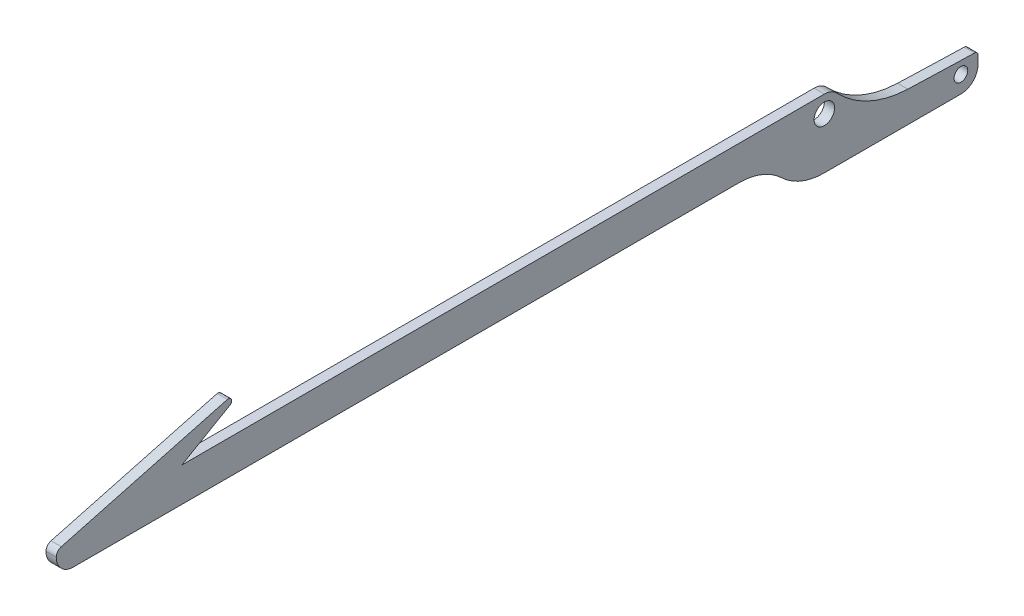
ISO-10303-21;
HEADER;
FILE_DESCRIPTION(('STEP AP214'),'2;1');
FILE_NAME('part.step','',(''),(''),'','','');
FILE_SCHEMA(('AUTOMOTIVE_DESIGN { 1 0 10303 214 1 1 1 1 }'));
ENDSEC;
DATA;
#1=APPLICATION_CONTEXT('core data for automotive mechanical design processes');
#2=APPLICATION_PROTOCOL_DEFINITION('international standard','automotive_design',2000,#1);
#3=PRODUCT_CONTEXT('',#1,'mechanical');
#4=PRODUCT('Part','Part','',(#3));
#5=PRODUCT_RELATED_PRODUCT_CATEGORY('part','',(#4));
#6=PRODUCT_DEFINITION_FORMATION('','',#4);
#7=PRODUCT_DEFINITION_CONTEXT('part definition',#1,'design');
#8=PRODUCT_DEFINITION('design','',#6,#7);
#9=PRODUCT_DEFINITION_SHAPE('','',#8);
#10=(LENGTH_UNIT() NAMED_UNIT(*) SI_UNIT(.MILLI.,.METRE.));
#11=(NAMED_UNIT(*) PLANE_ANGLE_UNIT() SI_UNIT($,.RADIAN.));
#12=(NAMED_UNIT(*) SI_UNIT($,.STERADIAN.) SOLID_ANGLE_UNIT());
#13=UNCERTAINTY_MEASURE_WITH_UNIT(LENGTH_MEASURE(1.E-05),#10,'distance_accuracy_value','');
#14=(GEOMETRIC_REPRESENTATION_CONTEXT(3) GLOBAL_UNCERTAINTY_ASSIGNED_CONTEXT((#13)) GLOBAL_UNIT_ASSIGNED_CONTEXT((#10,
#11,#12)) REPRESENTATION_CONTEXT('',''));
#15=CARTESIAN_POINT('',(0.,0.,0.));
#16=DIRECTION('',(0.,0.,1.));
#17=DIRECTION('',(1.,0.,0.));
#18=AXIS2_PLACEMENT_3D('',#15,#16,#17);
#19=CARTESIAN_POINT('',(-72.2106781186548,-15.,25.));
#20=DIRECTION('',(0.,-1.,0.));
#21=DIRECTION('',(0.,0.,-1.));
#22=AXIS2_PLACEMENT_3D('',#19,#20,#21);
#23=PLANE('',#22);
#24=DIRECTION('',(0.,0.,-1.));
#25=VECTOR('',#24,1.);
#26=CARTESIAN_POINT('',(1.5,-15.,25.));
#27=LINE('',#26,#25);
#28=CARTESIAN_POINT('',(1.5,-15.,0.));
#29=VERTEX_POINT('',#28);
#30=CARTESIAN_POINT('',(1.5,-15.,-40.));
#31=VERTEX_POINT('',#30);
#32=EDGE_CURVE('E376',#29,#31,#27,.T.);
#33=ORIENTED_EDGE('',*,*,#32,.F.);
#34=DIRECTION('',(1.,0.,0.));
#35=VECTOR('',#34,1.);
#36=CARTESIAN_POINT('',(-1.5,-15.,0.));
#37=LINE('',#36,#35);
#38=CARTESIAN_POINT('',(-1.5,-15.,0.));
#39=VERTEX_POINT('',#38);
#40=EDGE_CURVE('E388',#39,#29,#37,.T.);
#41=ORIENTED_EDGE('',*,*,#40,.F.);
#42=DIRECTION('',(0.,0.,1.));
#43=VECTOR('',#42,1.);
#44=CARTESIAN_POINT('',(-1.5,-15.,25.));
#45=LINE('',#44,#43);
#46=CARTESIAN_POINT('',(-1.5,-15.,-40.));
#47=VERTEX_POINT('',#46);
#48=EDGE_CURVE('E357',#47,#39,#45,.T.);
#49=ORIENTED_EDGE('',*,*,#48,.F.);
#50=DIRECTION('',(1.,0.,0.));
#51=VECTOR('',#50,1.);
#52=CARTESIAN_POINT('',(-72.2106781186548,-15.,-40.));
#53=LINE('',#52,#51);
#54=EDGE_CURVE('E215',#47,#31,#53,.T.);
#55=ORIENTED_EDGE('',*,*,#54,.T.);
#56=EDGE_LOOP('',(#33,#41,#49,#55));
#57=FACE_BOUND('',#56,.T.);
#58=ADVANCED_FACE('F48',(#57),#23,.T.);
#59=CARTESIAN_POINT('',(1.5,0.,0.));
#60=DIRECTION('',(1.,0.,0.));
#61=DIRECTION('',(0.,0.,-1.));
#62=AXIS2_PLACEMENT_3D('',#59,#60,#61);
#63=PLANE('',#62);
#64=CARTESIAN_POINT('',(1.5,-10.,-40.));
#65=DIRECTION('',(1.,0.,0.));
#66=DIRECTION('',(0.,0.,-1.));
#67=AXIS2_PLACEMENT_3D('',#64,#65,#66);
#68=CIRCLE('',#67,2.);
#69=CARTESIAN_POINT('',(1.5,-10.,-42.));
#70=VERTEX_POINT('',#69);
#71=EDGE_CURVE('E408',#70,#70,#68,.T.);
#72=ORIENTED_EDGE('',*,*,#71,.F.);
#73=EDGE_LOOP('',(#72));
#74=FACE_BOUND('',#73,.T.);
#75=CARTESIAN_POINT('',(1.5,0.,0.));
#76=DIRECTION('',(1.,0.,0.));
#77=DIRECTION('',(0.,0.,-1.));
#78=AXIS2_PLACEMENT_3D('',#75,#76,#77);
#79=CIRCLE('',#78,3.);
#80=CARTESIAN_POINT('',(1.5,0.,-3.));
#81=VERTEX_POINT('',#80);
#82=EDGE_CURVE('E401',#81,#81,#79,.T.);
#83=ORIENTED_EDGE('',*,*,#82,.F.);
#84=EDGE_LOOP('',(#83));
#85=FACE_BOUND('',#84,.T.);
#86=CARTESIAN_POINT('',(1.5,-23.125,25.));
#87=DIRECTION('',(1.,0.,0.));
#88=DIRECTION('',(0.,0.,1.));
#89=AXIS2_PLACEMENT_3D('',#86,#87,#88);
#90=CIRCLE('',#89,18.125);
#91=CARTESIAN_POINT('',(1.5,-10.,12.5));
#92=VERTEX_POINT('',#91);
#93=CARTESIAN_POINT('',(1.5,-5.,25.));
#94=VERTEX_POINT('',#93);
#95=EDGE_CURVE('E172',#92,#94,#90,.T.);
#96=ORIENTED_EDGE('',*,*,#95,.F.);
#97=CARTESIAN_POINT('',(1.5,3.12499999999997,0.));
#98=DIRECTION('',(-1.,0.,0.));
#99=DIRECTION('',(0.,0.,-1.));
#100=AXIS2_PLACEMENT_3D('',#97,#98,#99);
#101=CIRCLE('',#100,18.125);
#102=EDGE_CURVE('E188',#29,#92,#101,.T.);
#103=ORIENTED_EDGE('',*,*,#102,.F.);
#104=ORIENTED_EDGE('',*,*,#32,.T.);
#105=CARTESIAN_POINT('',(1.5,-10.,-40.));
#106=DIRECTION('',(1.,0.,0.));
#107=DIRECTION('',(0.,0.,-1.));
#108=AXIS2_PLACEMENT_3D('',#105,#106,#107);
#109=CIRCLE('',#108,5.);
#110=CARTESIAN_POINT('',(1.5,-10.,-45.));
#111=VERTEX_POINT('',#110);
#112=EDGE_CURVE('E219',#31,#111,#109,.T.);
#113=ORIENTED_EDGE('',*,*,#112,.T.);
#114=DIRECTION('',(0.,1.,0.));
#115=VECTOR('',#114,1.);
#116=CARTESIAN_POINT('',(1.5,-5.00000000000003,-45.));
#117=LINE('',#116,#115);
#118=CARTESIAN_POINT('',(1.5,-7.57561463693124,-45.));
#119=VERTEX_POINT('',#118);
#120=EDGE_CURVE('E179',#111,#119,#117,.T.);
#121=ORIENTED_EDGE('',*,*,#120,.T.);
#122=CARTESIAN_POINT('',(1.5,-7.57561463693124,-44.));
#123=DIRECTION('',(1.,0.,0.));
#124=DIRECTION('',(0.,0.,-1.));
#125=AXIS2_PLACEMENT_3D('',#122,#123,#124);
#126=CIRCLE('',#125,1.);
#127=CARTESIAN_POINT('',(1.5,-6.57597878322358,-44.0269844396297));
#128=VERTEX_POINT('',#127);
#129=EDGE_CURVE('E246',#119,#128,#126,.T.);
#130=ORIENTED_EDGE('',*,*,#129,.T.);
#131=CARTESIAN_POINT('',(1.5,2529.99999999999,-112.5));
#132=DIRECTION('',(1.,0.,0.));
#133=DIRECTION('',(0.,0.,-1.));
#134=AXIS2_PLACEMENT_3D('',#131,#132,#133);
#135=CIRCLE('',#134,2537.49999999999);
#136=CARTESIAN_POINT('',(1.5,-5.97098693972997,-24.4238772428565));
#137=VERTEX_POINT('',#136);
#138=EDGE_CURVE('E382',#137,#128,#135,.T.);
#139=ORIENTED_EDGE('',*,*,#138,.F.);
#140=CARTESIAN_POINT('',(1.5,24.010936058572,-25.4651713050099));
#141=DIRECTION('',(1.,0.,0.));
#142=DIRECTION('',(0.,0.,-1.));
#143=AXIS2_PLACEMENT_3D('',#140,#141,#142);
#144=CIRCLE('',#143,30.);
#145=CARTESIAN_POINT('',(1.5,3.43013372264988,-3.63788161499795));
#146=VERTEX_POINT('',#145);
#147=EDGE_CURVE('E236',#137,#146,#144,.F.);
#148=ORIENTED_EDGE('',*,*,#147,.T.);
#149=CARTESIAN_POINT('',(1.5,0.,0.));
#150=DIRECTION('',(1.,0.,0.));
#151=DIRECTION('',(0.,0.,-1.));
#152=AXIS2_PLACEMENT_3D('',#149,#150,#151);
#153=CIRCLE('',#152,5.);
#154=CARTESIAN_POINT('',(1.5,5.,0.));
#155=VERTEX_POINT('',#154);
#156=EDGE_CURVE('E195',#146,#155,#153,.T.);
#157=ORIENTED_EDGE('',*,*,#156,.T.);
#158=DIRECTION('',(0.,0.,1.));
#159=VECTOR('',#158,1.);
#160=CARTESIAN_POINT('',(1.5,5.,0.));
#161=LINE('',#160,#159);
#162=CARTESIAN_POINT('',(1.5,4.99999999999998,188.203449267313));
#163=VERTEX_POINT('',#162);
#164=EDGE_CURVE('E202',#155,#163,#161,.T.);
#165=ORIENTED_EDGE('',*,*,#164,.T.);
#166=DIRECTION('',(0.,0.499999999999995,-0.866025403784442));
#167=VECTOR('',#166,1.);
#168=CARTESIAN_POINT('',(1.5,13.1339745962156,174.114991999192));
#169=LINE('',#168,#167);
#170=CARTESIAN_POINT('',(1.5,13.1339745962156,174.114991999192));
#171=VERTEX_POINT('',#170);
#172=EDGE_CURVE('E304',#163,#171,#169,.T.);
#173=ORIENTED_EDGE('',*,*,#172,.T.);
#174=CARTESIAN_POINT('',(1.5,14.,174.614991999192));
#175=DIRECTION('',(1.,0.,0.));
#176=DIRECTION('',(0.,0.,1.));
#177=AXIS2_PLACEMENT_3D('',#174,#175,#176);
#178=CIRCLE('',#177,1.);
#179=CARTESIAN_POINT('',(1.5,14.9659258262891,174.873811044295));
#180=VERTEX_POINT('',#179);
#181=EDGE_CURVE('E326',#171,#180,#178,.T.);
#182=ORIENTED_EDGE('',*,*,#181,.T.);
#183=DIRECTION('',(0.,-0.258819045102522,0.965925826289068));
#184=VECTOR('',#183,1.);
#185=CARTESIAN_POINT('',(1.5,1.93185165257814,223.517638090205));
#186=LINE('',#185,#184);
#187=CARTESIAN_POINT('',(1.5,1.93185165257814,223.517638090205));
#188=VERTEX_POINT('',#187);
#189=EDGE_CURVE('E331',#180,#188,#186,.T.);
#190=ORIENTED_EDGE('',*,*,#189,.T.);
#191=CARTESIAN_POINT('',(1.5,0.,223.));
#192=DIRECTION('',(1.,0.,0.));
#193=DIRECTION('',(0.,0.,-1.));
#194=AXIS2_PLACEMENT_3D('',#191,#192,#193);
#195=CIRCLE('',#194,2.);
#196=CARTESIAN_POINT('',(1.5,0.,225.));
#197=VERTEX_POINT('',#196);
#198=EDGE_CURVE('E352',#188,#197,#195,.T.);
#199=ORIENTED_EDGE('',*,*,#198,.T.);
#200=CARTESIAN_POINT('',(1.5,0.,220.));
#201=DIRECTION('',(1.,0.,0.));
#202=DIRECTION('',(0.,0.,-1.));
#203=AXIS2_PLACEMENT_3D('',#200,#201,#202);
#204=CIRCLE('',#203,5.);
#205=CARTESIAN_POINT('',(1.5,-5.00000000000003,220.));
#206=VERTEX_POINT('',#205);
#207=EDGE_CURVE('E274',#197,#206,#204,.T.);
#208=ORIENTED_EDGE('',*,*,#207,.T.);
#209=DIRECTION('',(0.,0.,-1.));
#210=VECTOR('',#209,1.);
#211=CARTESIAN_POINT('',(1.5,-5.,0.));
#212=LINE('',#211,#210);
#213=EDGE_CURVE('E211',#206,#94,#212,.T.);
#214=ORIENTED_EDGE('',*,*,#213,.T.);
#215=EDGE_LOOP('',(#96,#103,#104,#113,#121,#130,#139,#148,#157,#165,#173,#182,#190,#199,#208,#214));
#216=FACE_BOUND('',#215,.T.);
#217=ADVANCED_FACE('F341',(#74,#85,#216),#63,.T.);
#218=CARTESIAN_POINT('',(-1.5,0.,0.));
#219=DIRECTION('',(1.,0.,0.));
#220=DIRECTION('',(0.,0.,-1.));
#221=AXIS2_PLACEMENT_3D('',#218,#219,#220);
#222=PLANE('',#221);
#223=CARTESIAN_POINT('',(-1.5,-10.,-40.));
#224=DIRECTION('',(1.,0.,0.));
#225=DIRECTION('',(0.,0.,-1.));
#226=AXIS2_PLACEMENT_3D('',#223,#224,#225);
#227=CIRCLE('',#226,2.);
#228=CARTESIAN_POINT('',(-1.5,-10.,-42.));
#229=VERTEX_POINT('',#228);
#230=EDGE_CURVE('E404',#229,#229,#227,.T.);
#231=ORIENTED_EDGE('',*,*,#230,.T.);
#232=EDGE_LOOP('',(#231));
#233=FACE_BOUND('',#232,.T.);
#234=CARTESIAN_POINT('',(-1.5,0.,0.));
#235=DIRECTION('',(1.,0.,0.));
#236=DIRECTION('',(0.,0.,-1.));
#237=AXIS2_PLACEMENT_3D('',#234,#235,#236);
#238=CIRCLE('',#237,3.);
#239=CARTESIAN_POINT('',(-1.5,0.,-3.));
#240=VERTEX_POINT('',#239);
#241=EDGE_CURVE('E398',#240,#240,#238,.T.);
#242=ORIENTED_EDGE('',*,*,#241,.T.);
#243=EDGE_LOOP('',(#242));
#244=FACE_BOUND('',#243,.T.);
#245=CARTESIAN_POINT('',(-1.5,3.12499999999997,0.));
#246=DIRECTION('',(-1.,0.,0.));
#247=DIRECTION('',(0.,0.,-1.));
#248=AXIS2_PLACEMENT_3D('',#245,#246,#247);
#249=CIRCLE('',#248,18.125);
#250=CARTESIAN_POINT('',(-1.5,-10.,12.5));
#251=VERTEX_POINT('',#250);
#252=EDGE_CURVE('E66',#39,#251,#249,.T.);
#253=ORIENTED_EDGE('',*,*,#252,.T.);
#254=CARTESIAN_POINT('',(-1.5,-23.125,25.));
#255=DIRECTION('',(1.,0.,0.));
#256=DIRECTION('',(0.,0.,1.));
#257=AXIS2_PLACEMENT_3D('',#254,#255,#256);
#258=CIRCLE('',#257,18.125);
#259=CARTESIAN_POINT('',(-1.5,-5.,25.));
#260=VERTEX_POINT('',#259);
#261=EDGE_CURVE('E170',#251,#260,#258,.T.);
#262=ORIENTED_EDGE('',*,*,#261,.T.);
#263=DIRECTION('',(0.,0.,-1.));
#264=VECTOR('',#263,1.);
#265=CARTESIAN_POINT('',(-1.5,-5.,0.));
#266=LINE('',#265,#264);
#267=CARTESIAN_POINT('',(-1.5,-5.00000000000003,220.));
#268=VERTEX_POINT('',#267);
#269=EDGE_CURVE('E185',#268,#260,#266,.T.);
#270=ORIENTED_EDGE('',*,*,#269,.F.);
#271=CARTESIAN_POINT('',(-1.5,0.,220.));
#272=DIRECTION('',(1.,0.,0.));
#273=DIRECTION('',(0.,0.,-1.));
#274=AXIS2_PLACEMENT_3D('',#271,#272,#273);
#275=CIRCLE('',#274,5.);
#276=CARTESIAN_POINT('',(-1.5,0.,225.));
#277=VERTEX_POINT('',#276);
#278=EDGE_CURVE('E196',#277,#268,#275,.T.);
#279=ORIENTED_EDGE('',*,*,#278,.F.);
#280=CARTESIAN_POINT('',(-1.5,0.,223.));
#281=DIRECTION('',(1.,0.,0.));
#282=DIRECTION('',(0.,0.,-1.));
#283=AXIS2_PLACEMENT_3D('',#280,#281,#282);
#284=CIRCLE('',#283,2.);
#285=CARTESIAN_POINT('',(-1.5,1.93185165257814,223.517638090205));
#286=VERTEX_POINT('',#285);
#287=EDGE_CURVE('E351',#286,#277,#284,.T.);
#288=ORIENTED_EDGE('',*,*,#287,.F.);
#289=DIRECTION('',(0.,0.258819045102522,-0.965925826289068));
#290=VECTOR('',#289,1.);
#291=CARTESIAN_POINT('',(-1.5,1.93185165257814,223.517638090205));
#292=LINE('',#291,#290);
#293=CARTESIAN_POINT('',(-1.5,14.9659258262891,174.873811044295));
#294=VERTEX_POINT('',#293);
#295=EDGE_CURVE('E306',#286,#294,#292,.T.);
#296=ORIENTED_EDGE('',*,*,#295,.T.);
#297=CARTESIAN_POINT('',(-1.5,14.,174.614991999192));
#298=DIRECTION('',(1.,0.,0.));
#299=DIRECTION('',(0.,0.,-1.));
#300=AXIS2_PLACEMENT_3D('',#297,#298,#299);
#301=CIRCLE('',#300,1.);
#302=CARTESIAN_POINT('',(-1.5,13.1339745962156,174.114991999192));
#303=VERTEX_POINT('',#302);
#304=EDGE_CURVE('E308',#294,#303,#301,.F.);
#305=ORIENTED_EDGE('',*,*,#304,.T.);
#306=DIRECTION('',(0.,-0.499999999999995,0.866025403784442));
#307=VECTOR('',#306,1.);
#308=CARTESIAN_POINT('',(-1.5,13.1339745962156,174.114991999192));
#309=LINE('',#308,#307);
#310=CARTESIAN_POINT('',(-1.5,4.99999999999998,188.203449267313));
#311=VERTEX_POINT('',#310);
#312=EDGE_CURVE('E302',#303,#311,#309,.T.);
#313=ORIENTED_EDGE('',*,*,#312,.T.);
#314=DIRECTION('',(0.,0.,1.));
#315=VECTOR('',#314,1.);
#316=CARTESIAN_POINT('',(-1.5,5.,0.));
#317=LINE('',#316,#315);
#318=CARTESIAN_POINT('',(-1.5,5.,0.));
#319=VERTEX_POINT('',#318);
#320=EDGE_CURVE('E204',#319,#311,#317,.T.);
#321=ORIENTED_EDGE('',*,*,#320,.F.);
#322=CARTESIAN_POINT('',(-1.5,0.,0.));
#323=DIRECTION('',(1.,0.,0.));
#324=DIRECTION('',(0.,0.,-1.));
#325=AXIS2_PLACEMENT_3D('',#322,#323,#324);
#326=CIRCLE('',#325,5.);
#327=CARTESIAN_POINT('',(-1.5,3.43013372264988,-3.63788161499795));
#328=VERTEX_POINT('',#327);
#329=EDGE_CURVE('E288',#328,#319,#326,.T.);
#330=ORIENTED_EDGE('',*,*,#329,.F.);
#331=CARTESIAN_POINT('',(-1.5,24.010936058572,-25.4651713050099));
#332=DIRECTION('',(1.,0.,0.));
#333=DIRECTION('',(0.,0.,-1.));
#334=AXIS2_PLACEMENT_3D('',#331,#332,#333);
#335=CIRCLE('',#334,30.);
#336=CARTESIAN_POINT('',(-1.5,-5.97098693972997,-24.4238772428565));
#337=VERTEX_POINT('',#336);
#338=EDGE_CURVE('E239',#328,#337,#335,.T.);
#339=ORIENTED_EDGE('',*,*,#338,.T.);
#340=CARTESIAN_POINT('',(-1.5,2529.99999999999,-112.5));
#341=DIRECTION('',(1.,0.,0.));
#342=DIRECTION('',(0.,0.,-1.));
#343=AXIS2_PLACEMENT_3D('',#340,#341,#342);
#344=CIRCLE('',#343,2537.49999999999);
#345=CARTESIAN_POINT('',(-1.5,-6.57597878322358,-44.0269844396297));
#346=VERTEX_POINT('',#345);
#347=EDGE_CURVE('E379',#337,#346,#344,.T.);
#348=ORIENTED_EDGE('',*,*,#347,.T.);
#349=CARTESIAN_POINT('',(-1.5,-7.57561463693124,-44.));
#350=DIRECTION('',(1.,0.,0.));
#351=DIRECTION('',(0.,0.,-1.));
#352=AXIS2_PLACEMENT_3D('',#349,#350,#351);
#353=CIRCLE('',#352,1.);
#354=CARTESIAN_POINT('',(-1.5,-7.57561463693124,-45.));
#355=VERTEX_POINT('',#354);
#356=EDGE_CURVE('E11',#346,#355,#353,.F.);
#357=ORIENTED_EDGE('',*,*,#356,.T.);
#358=DIRECTION('',(0.,-1.,0.));
#359=VECTOR('',#358,1.);
#360=CARTESIAN_POINT('',(-1.5,-5.00000000000003,-45.));
#361=LINE('',#360,#359);
#362=CARTESIAN_POINT('',(-1.5,-10.,-45.));
#363=VERTEX_POINT('',#362);
#364=EDGE_CURVE('E178',#355,#363,#361,.T.);
#365=ORIENTED_EDGE('',*,*,#364,.T.);
#366=CARTESIAN_POINT('',(-1.5,-10.,-40.));
#367=DIRECTION('',(1.,0.,0.));
#368=DIRECTION('',(0.,0.,-1.));
#369=AXIS2_PLACEMENT_3D('',#366,#367,#368);
#370=CIRCLE('',#369,5.);
#371=EDGE_CURVE('E226',#363,#47,#370,.F.);
#372=ORIENTED_EDGE('',*,*,#371,.T.);
#373=ORIENTED_EDGE('',*,*,#48,.T.);
#374=EDGE_LOOP('',(#253,#262,#270,#279,#288,#296,#305,#313,#321,#330,#339,#348,#357,#365,#372,#373));
#375=FACE_BOUND('',#374,.T.);
#376=ADVANCED_FACE('F183',(#233,#244,#375),#222,.F.);
#377=CARTESIAN_POINT('',(1.5,0.,220.));
#378=DIRECTION('',(-1.,0.,0.));
#379=DIRECTION('',(0.,0.,1.));
#380=AXIS2_PLACEMENT_3D('',#377,#378,#379);
#381=CYLINDRICAL_SURFACE('',#380,5.);
#382=DIRECTION('',(1.,0.,0.));
#383=VECTOR('',#382,1.);
#384=CARTESIAN_POINT('',(-1.5,0.,225.));
#385=LINE('',#384,#383);
#386=EDGE_CURVE('E327',#277,#197,#385,.T.);
#387=ORIENTED_EDGE('',*,*,#386,.F.);
#388=ORIENTED_EDGE('',*,*,#278,.T.);
#389=DIRECTION('',(-1.,0.,0.));
#390=VECTOR('',#389,1.);
#391=CARTESIAN_POINT('',(1.5,-5.00000000000003,220.));
#392=LINE('',#391,#390);
#393=EDGE_CURVE('E193',#206,#268,#392,.T.);
#394=ORIENTED_EDGE('',*,*,#393,.F.);
#395=ORIENTED_EDGE('',*,*,#207,.F.);
#396=EDGE_LOOP('',(#387,#388,#394,#395));
#397=FACE_BOUND('',#396,.T.);
#398=ADVANCED_FACE('F457',(#397),#381,.T.);
#399=CARTESIAN_POINT('',(1.5,0.,0.));
#400=DIRECTION('',(-1.,0.,0.));
#401=DIRECTION('',(0.,0.,1.));
#402=AXIS2_PLACEMENT_3D('',#399,#400,#401);
#403=CYLINDRICAL_SURFACE('',#402,5.);
#404=ORIENTED_EDGE('',*,*,#156,.F.);
#405=DIRECTION('',(-1.,0.,0.));
#406=VECTOR('',#405,1.);
#407=CARTESIAN_POINT('',(1.5,3.43013372264988,-3.63788161499795));
#408=LINE('',#407,#406);
#409=EDGE_CURVE('E233',#146,#328,#408,.T.);
#410=ORIENTED_EDGE('',*,*,#409,.T.);
#411=ORIENTED_EDGE('',*,*,#329,.T.);
#412=DIRECTION('',(-1.,0.,0.));
#413=VECTOR('',#412,1.);
#414=CARTESIAN_POINT('',(1.5,5.,0.));
#415=LINE('',#414,#413);
#416=EDGE_CURVE('E210',#155,#319,#415,.T.);
#417=ORIENTED_EDGE('',*,*,#416,.F.);
#418=EDGE_LOOP('',(#404,#410,#411,#417));
#419=FACE_BOUND('',#418,.T.);
#420=ADVANCED_FACE('F462',(#419),#403,.T.);
#421=CARTESIAN_POINT('',(1.5,5.,0.));
#422=DIRECTION('',(0.,-1.,0.));
#423=DIRECTION('',(0.,0.,-1.));
#424=AXIS2_PLACEMENT_3D('',#421,#422,#423);
#425=PLANE('',#424);
#426=ORIENTED_EDGE('',*,*,#320,.T.);
#427=DIRECTION('',(1.,0.,0.));
#428=VECTOR('',#427,1.);
#429=CARTESIAN_POINT('',(1.5,4.99999999999998,188.203449267313));
#430=LINE('',#429,#428);
#431=EDGE_CURVE('E289',#311,#163,#430,.T.);
#432=ORIENTED_EDGE('',*,*,#431,.T.);
#433=ORIENTED_EDGE('',*,*,#164,.F.);
#434=ORIENTED_EDGE('',*,*,#416,.T.);
#435=EDGE_LOOP('',(#426,#432,#433,#434));
#436=FACE_BOUND('',#435,.T.);
#437=ADVANCED_FACE('F294',(#436),#425,.F.);
#438=CARTESIAN_POINT('',(1.5,-5.,0.));
#439=DIRECTION('',(0.,1.,0.));
#440=DIRECTION('',(0.,0.,1.));
#441=AXIS2_PLACEMENT_3D('',#438,#439,#440);
#442=PLANE('',#441);
#443=ORIENTED_EDGE('',*,*,#269,.T.);
#444=DIRECTION('',(1.,0.,0.));
#445=VECTOR('',#444,1.);
#446=CARTESIAN_POINT('',(-72.2106781186548,-5.00000000000003,25.));
#447=LINE('',#446,#445);
#448=EDGE_CURVE('E167',#260,#94,#447,.T.);
#449=ORIENTED_EDGE('',*,*,#448,.T.);
#450=ORIENTED_EDGE('',*,*,#213,.F.);
#451=ORIENTED_EDGE('',*,*,#393,.T.);
#452=EDGE_LOOP('',(#443,#449,#450,#451));
#453=FACE_BOUND('',#452,.T.);
#454=ADVANCED_FACE('F191',(#453),#442,.F.);
#455=CARTESIAN_POINT('',(-55.0296090705236,1.93185165257814,223.517638090205));
#456=DIRECTION('',(0.,0.965925826289068,0.258819045102522));
#457=DIRECTION('',(0.,-0.258819045102522,0.965925826289068));
#458=AXIS2_PLACEMENT_3D('',#455,#456,#457);
#459=PLANE('',#458);
#460=ORIENTED_EDGE('',*,*,#295,.F.);
#461=DIRECTION('',(1.,0.,0.));
#462=VECTOR('',#461,1.);
#463=CARTESIAN_POINT('',(-1.5,1.93185165257814,223.517638090205));
#464=LINE('',#463,#462);
#465=EDGE_CURVE('E319',#286,#188,#464,.T.);
#466=ORIENTED_EDGE('',*,*,#465,.T.);
#467=ORIENTED_EDGE('',*,*,#189,.F.);
#468=DIRECTION('',(1.,0.,0.));
#469=VECTOR('',#468,1.);
#470=CARTESIAN_POINT('',(-55.0296090705236,14.9659258262891,174.873811044295));
#471=LINE('',#470,#469);
#472=EDGE_CURVE('E310',#294,#180,#471,.T.);
#473=ORIENTED_EDGE('',*,*,#472,.F.);
#474=EDGE_LOOP('',(#460,#466,#467,#473));
#475=FACE_BOUND('',#474,.T.);
#476=ADVANCED_FACE('F345',(#475),#459,.T.);
#477=CARTESIAN_POINT('',(-55.0296090705236,13.1339745962156,174.114991999192));
#478=DIRECTION('',(0.,-0.866025403784442,-0.499999999999995));
#479=DIRECTION('',(0.,0.499999999999995,-0.866025403784442));
#480=AXIS2_PLACEMENT_3D('',#477,#478,#479);
#481=PLANE('',#480);
#482=ORIENTED_EDGE('',*,*,#431,.F.);
#483=ORIENTED_EDGE('',*,*,#312,.F.);
#484=DIRECTION('',(1.,0.,0.));
#485=VECTOR('',#484,1.);
#486=CARTESIAN_POINT('',(-55.0296090705236,13.1339745962156,174.114991999192));
#487=LINE('',#486,#485);
#488=EDGE_CURVE('E316',#303,#171,#487,.T.);
#489=ORIENTED_EDGE('',*,*,#488,.T.);
#490=ORIENTED_EDGE('',*,*,#172,.F.);
#491=EDGE_LOOP('',(#482,#483,#489,#490));
#492=FACE_BOUND('',#491,.T.);
#493=ADVANCED_FACE('F300',(#492),#481,.T.);
#494=CARTESIAN_POINT('',(-55.0296090705236,14.,174.614991999192));
#495=DIRECTION('',(1.,0.,0.));
#496=DIRECTION('',(0.,0.,-1.));
#497=AXIS2_PLACEMENT_3D('',#494,#495,#496);
#498=CYLINDRICAL_SURFACE('',#497,1.);
#499=ORIENTED_EDGE('',*,*,#304,.F.);
#500=ORIENTED_EDGE('',*,*,#472,.T.);
#501=ORIENTED_EDGE('',*,*,#181,.F.);
#502=ORIENTED_EDGE('',*,*,#488,.F.);
#503=EDGE_LOOP('',(#499,#500,#501,#502));
#504=FACE_BOUND('',#503,.T.);
#505=ADVANCED_FACE('F338',(#504),#498,.T.);
#506=CARTESIAN_POINT('',(-1.5,0.,223.));
#507=DIRECTION('',(1.,0.,0.));
#508=DIRECTION('',(0.,0.,-1.));
#509=AXIS2_PLACEMENT_3D('',#506,#507,#508);
#510=CYLINDRICAL_SURFACE('',#509,2.);
#511=ORIENTED_EDGE('',*,*,#198,.F.);
#512=ORIENTED_EDGE('',*,*,#465,.F.);
#513=ORIENTED_EDGE('',*,*,#287,.T.);
#514=ORIENTED_EDGE('',*,*,#386,.T.);
#515=EDGE_LOOP('',(#511,#512,#513,#514));
#516=FACE_BOUND('',#515,.T.);
#517=ADVANCED_FACE('F353',(#516),#510,.T.);
#518=CARTESIAN_POINT('',(-72.2106781186548,-5.00000000000003,-45.));
#519=DIRECTION('',(0.,0.,-1.));
#520=DIRECTION('',(0.,1.,0.));
#521=AXIS2_PLACEMENT_3D('',#518,#519,#520);
#522=PLANE('',#521);
#523=ORIENTED_EDGE('',*,*,#364,.F.);
#524=DIRECTION('',(-1.,0.,0.));
#525=VECTOR('',#524,1.);
#526=CARTESIAN_POINT('',(1.5,-7.57561463693124,-45.));
#527=LINE('',#526,#525);
#528=EDGE_CURVE('E242',#355,#119,#527,.F.);
#529=ORIENTED_EDGE('',*,*,#528,.T.);
#530=ORIENTED_EDGE('',*,*,#120,.F.);
#531=DIRECTION('',(1.,0.,0.));
#532=VECTOR('',#531,1.);
#533=CARTESIAN_POINT('',(-72.2106781186548,-10.,-45.));
#534=LINE('',#533,#532);
#535=EDGE_CURVE('E222',#111,#363,#534,.F.);
#536=ORIENTED_EDGE('',*,*,#535,.T.);
#537=EDGE_LOOP('',(#523,#529,#530,#536));
#538=FACE_BOUND('',#537,.T.);
#539=ADVANCED_FACE('F445',(#538),#522,.T.);
#540=CARTESIAN_POINT('',(-1.5,2529.99999999999,-112.5));
#541=DIRECTION('',(1.,0.,0.));
#542=DIRECTION('',(0.,0.,-1.));
#543=AXIS2_PLACEMENT_3D('',#540,#541,#542);
#544=CYLINDRICAL_SURFACE('',#543,2537.49999999999);
#545=ORIENTED_EDGE('',*,*,#138,.T.);
#546=DIRECTION('',(1.,0.,0.));
#547=VECTOR('',#546,1.);
#548=CARTESIAN_POINT('',(-1.5,-6.57597878322358,-44.0269844396297));
#549=LINE('',#548,#547);
#550=EDGE_CURVE('E57',#128,#346,#549,.F.);
#551=ORIENTED_EDGE('',*,*,#550,.T.);
#552=ORIENTED_EDGE('',*,*,#347,.F.);
#553=DIRECTION('',(1.,0.,0.));
#554=VECTOR('',#553,1.);
#555=CARTESIAN_POINT('',(-1.5,-5.97098693972997,-24.4238772428565));
#556=LINE('',#555,#554);
#557=EDGE_CURVE('E229',#337,#137,#556,.T.);
#558=ORIENTED_EDGE('',*,*,#557,.T.);
#559=EDGE_LOOP('',(#545,#551,#552,#558));
#560=FACE_BOUND('',#559,.T.);
#561=ADVANCED_FACE('F472',(#560),#544,.F.);
#562=CARTESIAN_POINT('',(-72.2106781186548,-10.,-40.));
#563=DIRECTION('',(1.,0.,0.));
#564=DIRECTION('',(0.,0.,-1.));
#565=AXIS2_PLACEMENT_3D('',#562,#563,#564);
#566=CYLINDRICAL_SURFACE('',#565,5.);
#567=ORIENTED_EDGE('',*,*,#371,.F.);
#568=ORIENTED_EDGE('',*,*,#535,.F.);
#569=ORIENTED_EDGE('',*,*,#112,.F.);
#570=ORIENTED_EDGE('',*,*,#54,.F.);
#571=EDGE_LOOP('',(#567,#568,#569,#570));
#572=FACE_BOUND('',#571,.T.);
#573=ADVANCED_FACE('F469',(#572),#566,.T.);
#574=CARTESIAN_POINT('',(1.5,24.010936058572,-25.4651713050099));
#575=DIRECTION('',(1.,0.,0.));
#576=DIRECTION('',(0.,0.,-1.));
#577=AXIS2_PLACEMENT_3D('',#574,#575,#576);
#578=CYLINDRICAL_SURFACE('',#577,30.);
#579=ORIENTED_EDGE('',*,*,#338,.F.);
#580=ORIENTED_EDGE('',*,*,#409,.F.);
#581=ORIENTED_EDGE('',*,*,#147,.F.);
#582=ORIENTED_EDGE('',*,*,#557,.F.);
#583=EDGE_LOOP('',(#579,#580,#581,#582));
#584=FACE_BOUND('',#583,.T.);
#585=ADVANCED_FACE('F471',(#584),#578,.F.);
#586=CARTESIAN_POINT('',(-1.5,-7.57561463693124,-44.));
#587=DIRECTION('',(1.,0.,0.));
#588=DIRECTION('',(0.,0.,-1.));
#589=AXIS2_PLACEMENT_3D('',#586,#587,#588);
#590=CYLINDRICAL_SURFACE('',#589,1.);
#591=ORIENTED_EDGE('',*,*,#356,.F.);
#592=ORIENTED_EDGE('',*,*,#550,.F.);
#593=ORIENTED_EDGE('',*,*,#129,.F.);
#594=ORIENTED_EDGE('',*,*,#528,.F.);
#595=EDGE_LOOP('',(#591,#592,#593,#594));
#596=FACE_BOUND('',#595,.T.);
#597=ADVANCED_FACE('F50',(#596),#590,.T.);
#598=CARTESIAN_POINT('',(-1.5,-23.125,25.));
#599=DIRECTION('',(1.,0.,0.));
#600=DIRECTION('',(0.,0.,-1.));
#601=AXIS2_PLACEMENT_3D('',#598,#599,#600);
#602=CYLINDRICAL_SURFACE('',#601,18.125);
#603=ORIENTED_EDGE('',*,*,#95,.T.);
#604=ORIENTED_EDGE('',*,*,#448,.F.);
#605=ORIENTED_EDGE('',*,*,#261,.F.);
#606=DIRECTION('',(1.,0.,0.));
#607=VECTOR('',#606,1.);
#608=CARTESIAN_POINT('',(-1.5,-10.,12.5));
#609=LINE('',#608,#607);
#610=EDGE_CURVE('E385',#251,#92,#609,.T.);
#611=ORIENTED_EDGE('',*,*,#610,.T.);
#612=EDGE_LOOP('',(#603,#604,#605,#611));
#613=FACE_BOUND('',#612,.T.);
#614=ADVANCED_FACE('F169',(#613),#602,.F.);
#615=CARTESIAN_POINT('',(-1.5,3.12499999999997,0.));
#616=DIRECTION('',(1.,0.,0.));
#617=DIRECTION('',(0.,0.,-1.));
#618=AXIS2_PLACEMENT_3D('',#615,#616,#617);
#619=CYLINDRICAL_SURFACE('',#618,18.125);
#620=ORIENTED_EDGE('',*,*,#102,.T.);
#621=ORIENTED_EDGE('',*,*,#610,.F.);
#622=ORIENTED_EDGE('',*,*,#252,.F.);
#623=ORIENTED_EDGE('',*,*,#40,.T.);
#624=EDGE_LOOP('',(#620,#621,#622,#623));
#625=FACE_BOUND('',#624,.T.);
#626=ADVANCED_FACE('F429',(#625),#619,.T.);
#627=CARTESIAN_POINT('',(-1.5,0.,0.));
#628=DIRECTION('',(1.,0.,0.));
#629=DIRECTION('',(0.,0.,-1.));
#630=AXIS2_PLACEMENT_3D('',#627,#628,#629);
#631=CYLINDRICAL_SURFACE('',#630,3.);
#632=ORIENTED_EDGE('',*,*,#241,.F.);
#633=EDGE_LOOP('',(#632));
#634=FACE_BOUND('',#633,.T.);
#635=ORIENTED_EDGE('',*,*,#82,.T.);
#636=EDGE_LOOP('',(#635));
#637=FACE_BOUND('',#636,.T.);
#638=ADVANCED_FACE('F419',(#634,#637),#631,.F.);
#639=CARTESIAN_POINT('',(-1.5,-10.,-40.));
#640=DIRECTION('',(1.,0.,0.));
#641=DIRECTION('',(0.,0.,-1.));
#642=AXIS2_PLACEMENT_3D('',#639,#640,#641);
#643=CYLINDRICAL_SURFACE('',#642,2.);
#644=ORIENTED_EDGE('',*,*,#230,.F.);
#645=EDGE_LOOP('',(#644));
#646=FACE_BOUND('',#645,.T.);
#647=ORIENTED_EDGE('',*,*,#71,.T.);
#648=EDGE_LOOP('',(#647));
#649=FACE_BOUND('',#648,.T.);
#650=ADVANCED_FACE('F416',(#646,#649),#643,.F.);
#651=CLOSED_SHELL('',(#58,#217,#376,#398,#420,#437,#454,#476,#493,#505,#517,#539,#561,#573,#585,
#597,#614,#626,#638,#650));
#652=MANIFOLD_SOLID_BREP('B2',#651);
#653=ADVANCED_BREP_SHAPE_REPRESENTATION('',(#18,#652),#14);
#654=SHAPE_DEFINITION_REPRESENTATION(#9,#653);
ENDSEC;
END-ISO-10303-21;
